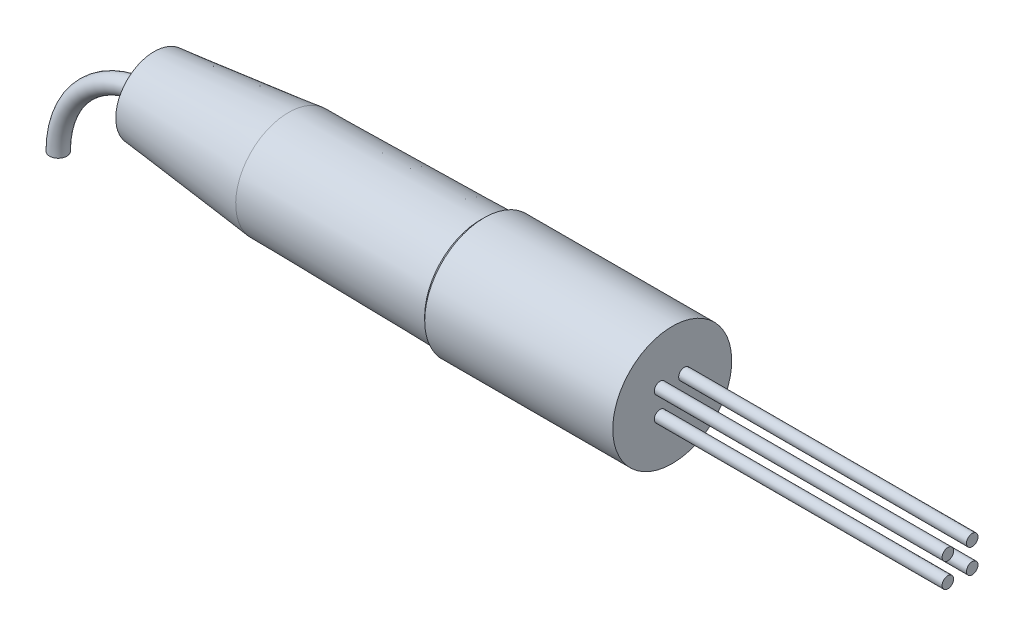
ISO-10303-21;
HEADER;
FILE_DESCRIPTION(('STEP AP214'),'2;1');
FILE_NAME('part.step','',(''),(''),'','','');
FILE_SCHEMA(('AUTOMOTIVE_DESIGN { 1 0 10303 214 1 1 1 1 }'));
ENDSEC;
DATA;
#1=APPLICATION_CONTEXT('core data for automotive mechanical design processes');
#2=APPLICATION_PROTOCOL_DEFINITION('international standard','automotive_design',2000,#1);
#3=PRODUCT_CONTEXT('',#1,'mechanical');
#4=PRODUCT('Part','Part','',(#3));
#5=PRODUCT_RELATED_PRODUCT_CATEGORY('part','',(#4));
#6=PRODUCT_DEFINITION_FORMATION('','',#4);
#7=PRODUCT_DEFINITION_CONTEXT('part definition',#1,'design');
#8=PRODUCT_DEFINITION('design','',#6,#7);
#9=PRODUCT_DEFINITION_SHAPE('','',#8);
#10=(LENGTH_UNIT() NAMED_UNIT(*) SI_UNIT(.MILLI.,.METRE.));
#11=(NAMED_UNIT(*) PLANE_ANGLE_UNIT() SI_UNIT($,.RADIAN.));
#12=(NAMED_UNIT(*) SI_UNIT($,.STERADIAN.) SOLID_ANGLE_UNIT());
#13=UNCERTAINTY_MEASURE_WITH_UNIT(LENGTH_MEASURE(1.E-05),#10,'distance_accuracy_value','');
#14=(GEOMETRIC_REPRESENTATION_CONTEXT(3) GLOBAL_UNCERTAINTY_ASSIGNED_CONTEXT((#13)) GLOBAL_UNIT_ASSIGNED_CONTEXT((#10,
#11,#12)) REPRESENTATION_CONTEXT('',''));
#15=CARTESIAN_POINT('',(0.,0.,0.));
#16=DIRECTION('',(0.,0.,1.));
#17=DIRECTION('',(1.,0.,0.));
#18=AXIS2_PLACEMENT_3D('',#15,#16,#17);
#19=CARTESIAN_POINT('',(0.,0.,0.));
#20=DIRECTION('',(-1.,0.,0.));
#21=DIRECTION('',(0.,-1.,0.));
#22=AXIS2_PLACEMENT_3D('',#19,#20,#21);
#23=PLANE('',#22);
#24=CARTESIAN_POINT('',(0.,0.635000000000003,-0.634999999999999));
#25=DIRECTION('',(-1.,0.,0.));
#26=DIRECTION('',(0.,-1.,0.));
#27=AXIS2_PLACEMENT_3D('',#24,#25,#26);
#28=CIRCLE('',#27,0.3);
#29=CARTESIAN_POINT('',(0.,0.335000000000003,-0.634999999999999));
#30=VERTEX_POINT('',#29);
#31=EDGE_CURVE('E37',#30,#30,#28,.F.);
#32=ORIENTED_EDGE('',*,*,#31,.F.);
#33=EDGE_LOOP('',(#32));
#34=FACE_BOUND('',#33,.T.);
#35=CARTESIAN_POINT('',(0.,0.635,0.634999999999999));
#36=DIRECTION('',(-1.,0.,0.));
#37=DIRECTION('',(0.,-1.,0.));
#38=AXIS2_PLACEMENT_3D('',#35,#36,#37);
#39=CIRCLE('',#38,0.3);
#40=CARTESIAN_POINT('',(0.,0.335,0.634999999999999));
#41=VERTEX_POINT('',#40);
#42=EDGE_CURVE('E45',#41,#41,#39,.F.);
#43=ORIENTED_EDGE('',*,*,#42,.F.);
#44=EDGE_LOOP('',(#43));
#45=FACE_BOUND('',#44,.T.);
#46=CARTESIAN_POINT('',(0.,0.,0.));
#47=DIRECTION('',(-1.,0.,0.));
#48=DIRECTION('',(0.,-1.,0.));
#49=AXIS2_PLACEMENT_3D('',#46,#47,#48);
#50=CIRCLE('',#49,3.1);
#51=CARTESIAN_POINT('',(0.,-3.1,0.));
#52=VERTEX_POINT('',#51);
#53=EDGE_CURVE('E63',#52,#52,#50,.T.);
#54=ORIENTED_EDGE('',*,*,#53,.F.);
#55=EDGE_LOOP('',(#54));
#56=FACE_BOUND('',#55,.T.);
#57=CARTESIAN_POINT('',(0.,-0.635,0.634999999999999));
#58=DIRECTION('',(-1.,0.,0.));
#59=DIRECTION('',(0.,-1.,0.));
#60=AXIS2_PLACEMENT_3D('',#57,#58,#59);
#61=CIRCLE('',#60,0.3);
#62=CARTESIAN_POINT('',(0.,-0.935,0.634999999999999));
#63=VERTEX_POINT('',#62);
#64=EDGE_CURVE('E41',#63,#63,#61,.F.);
#65=ORIENTED_EDGE('',*,*,#64,.F.);
#66=EDGE_LOOP('',(#65));
#67=FACE_BOUND('',#66,.T.);
#68=CARTESIAN_POINT('',(0.,-0.634999999999996,-0.634999999999999));
#69=DIRECTION('',(-1.,0.,0.));
#70=DIRECTION('',(0.,-1.,0.));
#71=AXIS2_PLACEMENT_3D('',#68,#69,#70);
#72=CIRCLE('',#71,0.3);
#73=CARTESIAN_POINT('',(0.,-0.934999999999996,-0.634999999999999));
#74=VERTEX_POINT('',#73);
#75=EDGE_CURVE('E10',#74,#74,#72,.F.);
#76=ORIENTED_EDGE('',*,*,#75,.F.);
#77=EDGE_LOOP('',(#76));
#78=FACE_BOUND('',#77,.T.);
#79=ADVANCED_FACE('F31',(#34,#45,#56,#67,#78),#23,.F.);
#80=CARTESIAN_POINT('',(-27.,1.99999999999999,0.));
#81=DIRECTION('',(1.,0.,0.));
#82=DIRECTION('',(0.,1.,0.));
#83=AXIS2_PLACEMENT_3D('',#80,#81,#82);
#84=PLANE('',#83);
#85=CARTESIAN_POINT('',(-27.,0.,0.));
#86=DIRECTION('',(-1.,0.,0.));
#87=DIRECTION('',(0.,-1.,0.));
#88=AXIS2_PLACEMENT_3D('',#85,#86,#87);
#89=CIRCLE('',#88,1.99999999999999);
#90=CARTESIAN_POINT('',(-27.,-1.99999999999999,0.));
#91=VERTEX_POINT('',#90);
#92=EDGE_CURVE('E54',#91,#91,#89,.T.);
#93=ORIENTED_EDGE('',*,*,#92,.T.);
#94=EDGE_LOOP('',(#93));
#95=FACE_BOUND('',#94,.T.);
#96=CARTESIAN_POINT('',(-27.,0.,0.));
#97=DIRECTION('',(-1.,0.,0.));
#98=DIRECTION('',(0.,-1.,0.));
#99=AXIS2_PLACEMENT_3D('',#96,#97,#98);
#100=CIRCLE('',#99,0.45);
#101=CARTESIAN_POINT('',(-27.,0.45,0.));
#102=VERTEX_POINT('',#101);
#103=EDGE_CURVE('E50',#102,#102,#100,.T.);
#104=ORIENTED_EDGE('',*,*,#103,.F.);
#105=EDGE_LOOP('',(#104));
#106=FACE_BOUND('',#105,.T.);
#107=ADVANCED_FACE('F99',(#95,#106),#84,.F.);
#108=CARTESIAN_POINT('',(-20.,0.,0.));
#109=DIRECTION('',(1.,0.,0.));
#110=DIRECTION('',(0.,1.,0.));
#111=AXIS2_PLACEMENT_3D('',#108,#109,#110);
#112=CONICAL_SURFACE('',#111,2.75,0.106735672649136);
#113=ORIENTED_EDGE('',*,*,#92,.F.);
#114=EDGE_LOOP('',(#113));
#115=FACE_BOUND('',#114,.T.);
#116=CARTESIAN_POINT('',(-20.,0.,0.));
#117=DIRECTION('',(-1.,0.,0.));
#118=DIRECTION('',(0.,-1.,0.));
#119=AXIS2_PLACEMENT_3D('',#116,#117,#118);
#120=CIRCLE('',#119,2.75);
#121=CARTESIAN_POINT('',(-20.,-2.75,0.));
#122=VERTEX_POINT('',#121);
#123=EDGE_CURVE('E57',#122,#122,#120,.T.);
#124=ORIENTED_EDGE('',*,*,#123,.T.);
#125=EDGE_LOOP('',(#124));
#126=FACE_BOUND('',#125,.T.);
#127=ADVANCED_FACE('F104',(#115,#126),#112,.T.);
#128=CARTESIAN_POINT('',(-10.,0.,0.));
#129=DIRECTION('',(1.,0.,0.));
#130=DIRECTION('',(0.,1.,0.));
#131=AXIS2_PLACEMENT_3D('',#128,#129,#130);
#132=CONICAL_SURFACE('',#131,2.9,0.0149988751518507);
#133=ORIENTED_EDGE('',*,*,#123,.F.);
#134=EDGE_LOOP('',(#133));
#135=FACE_BOUND('',#134,.T.);
#136=CARTESIAN_POINT('',(-10.,0.,0.));
#137=DIRECTION('',(-1.,0.,0.));
#138=DIRECTION('',(0.,-1.,0.));
#139=AXIS2_PLACEMENT_3D('',#136,#137,#138);
#140=CIRCLE('',#139,2.9);
#141=CARTESIAN_POINT('',(-10.,-2.9,0.));
#142=VERTEX_POINT('',#141);
#143=EDGE_CURVE('E60',#142,#142,#140,.T.);
#144=ORIENTED_EDGE('',*,*,#143,.T.);
#145=EDGE_LOOP('',(#144));
#146=FACE_BOUND('',#145,.T.);
#147=ADVANCED_FACE('F150',(#135,#146),#132,.T.);
#148=CARTESIAN_POINT('',(-27.,0.,0.));
#149=DIRECTION('',(-1.,0.,0.));
#150=DIRECTION('',(0.,-1.,0.));
#151=AXIS2_PLACEMENT_3D('',#148,#149,#150);
#152=CYLINDRICAL_SURFACE('',#151,3.1);
#153=CARTESIAN_POINT('',(-9.80000000000001,0.,0.));
#154=DIRECTION('',(1.,0.,0.));
#155=DIRECTION('',(0.,1.,0.));
#156=AXIS2_PLACEMENT_3D('',#153,#154,#155);
#157=CIRCLE('',#156,3.1);
#158=CARTESIAN_POINT('',(-9.80000000000001,3.1,0.));
#159=VERTEX_POINT('',#158);
#160=EDGE_CURVE('E51',#159,#159,#157,.T.);
#161=ORIENTED_EDGE('',*,*,#160,.T.);
#162=EDGE_LOOP('',(#161));
#163=FACE_BOUND('',#162,.T.);
#164=ORIENTED_EDGE('',*,*,#53,.T.);
#165=EDGE_LOOP('',(#164));
#166=FACE_BOUND('',#165,.T.);
#167=ADVANCED_FACE('F146',(#163,#166),#152,.T.);
#168=CARTESIAN_POINT('',(-10.,0.,0.));
#169=DIRECTION('',(1.,0.,0.));
#170=DIRECTION('',(0.,1.,0.));
#171=AXIS2_PLACEMENT_3D('',#168,#169,#170);
#172=CONICAL_SURFACE('',#171,2.9,0.785398163397456);
#173=ORIENTED_EDGE('',*,*,#160,.F.);
#174=EDGE_LOOP('',(#173));
#175=FACE_BOUND('',#174,.T.);
#176=ORIENTED_EDGE('',*,*,#143,.F.);
#177=EDGE_LOOP('',(#176));
#178=FACE_BOUND('',#177,.T.);
#179=ADVANCED_FACE('F142',(#175,#178),#172,.T.);
#180=CARTESIAN_POINT('',(-27.,-5.,0.));
#181=DIRECTION('',(0.,0.,-1.));
#182=DIRECTION('',(-1.,0.,0.));
#183=AXIS2_PLACEMENT_3D('',#180,#181,#182);
#184=TOROIDAL_SURFACE('',#183,5.,0.45);
#185=CARTESIAN_POINT('',(-32.,-5.,0.));
#186=DIRECTION('',(0.,-1.,0.));
#187=DIRECTION('',(1.,0.,0.));
#188=AXIS2_PLACEMENT_3D('',#185,#186,#187);
#189=CIRCLE('',#188,0.45);
#190=CARTESIAN_POINT('',(-32.45,-5.,0.));
#191=VERTEX_POINT('',#190);
#192=EDGE_CURVE('E66',#191,#191,#189,.T.);
#193=CARTESIAN_POINT('',(-27.,-5.,0.));
#194=DIRECTION('',(0.,0.,-1.));
#195=DIRECTION('',(-1.,0.,0.));
#196=AXIS2_PLACEMENT_3D('',#193,#194,#195);
#197=CIRCLE('',#196,5.45);
#198=EDGE_CURVE('',#191,#102,#197,.T.);
#199=ORIENTED_EDGE('',*,*,#192,.F.);
#200=ORIENTED_EDGE('',*,*,#103,.T.);
#201=ORIENTED_EDGE('',*,*,#198,.T.);
#202=ORIENTED_EDGE('',*,*,#198,.F.);
#203=EDGE_LOOP('',(#199,#201,#200,#202));
#204=FACE_BOUND('',#203,.T.);
#205=ADVANCED_FACE('F138',(#204),#184,.T.);
#206=CARTESIAN_POINT('',(-32.,-5.,0.));
#207=DIRECTION('',(0.,-1.,0.));
#208=DIRECTION('',(1.,0.,0.));
#209=AXIS2_PLACEMENT_3D('',#206,#207,#208);
#210=PLANE('',#209);
#211=ORIENTED_EDGE('',*,*,#192,.T.);
#212=EDGE_LOOP('',(#211));
#213=FACE_BOUND('',#212,.T.);
#214=ADVANCED_FACE('F134',(#213),#210,.T.);
#215=CARTESIAN_POINT('',(15.,0.635,0.634999999999999));
#216=DIRECTION('',(-1.,0.,0.));
#217=DIRECTION('',(0.,-1.,0.));
#218=AXIS2_PLACEMENT_3D('',#215,#216,#217);
#219=CYLINDRICAL_SURFACE('',#218,0.3);
#220=CARTESIAN_POINT('',(15.,0.635,0.634999999999999));
#221=DIRECTION('',(1.,0.,0.));
#222=DIRECTION('',(0.,1.,0.));
#223=AXIS2_PLACEMENT_3D('',#220,#221,#222);
#224=CIRCLE('',#223,0.3);
#225=CARTESIAN_POINT('',(15.,0.935,0.634999999999999));
#226=VERTEX_POINT('',#225);
#227=EDGE_CURVE('E69',#226,#226,#224,.T.);
#228=ORIENTED_EDGE('',*,*,#227,.F.);
#229=EDGE_LOOP('',(#228));
#230=FACE_BOUND('',#229,.T.);
#231=ORIENTED_EDGE('',*,*,#42,.T.);
#232=EDGE_LOOP('',(#231));
#233=FACE_BOUND('',#232,.T.);
#234=ADVANCED_FACE('F126',(#230,#233),#219,.T.);
#235=CARTESIAN_POINT('',(15.,0.635,0.634999999999999));
#236=DIRECTION('',(1.,0.,0.));
#237=DIRECTION('',(0.,1.,0.));
#238=AXIS2_PLACEMENT_3D('',#235,#236,#237);
#239=PLANE('',#238);
#240=ORIENTED_EDGE('',*,*,#227,.T.);
#241=EDGE_LOOP('',(#240));
#242=FACE_BOUND('',#241,.T.);
#243=ADVANCED_FACE('F117',(#242),#239,.T.);
#244=CARTESIAN_POINT('',(15.,-0.635,0.634999999999999));
#245=DIRECTION('',(-1.,0.,0.));
#246=DIRECTION('',(0.,-1.,0.));
#247=AXIS2_PLACEMENT_3D('',#244,#245,#246);
#248=CYLINDRICAL_SURFACE('',#247,0.3);
#249=CARTESIAN_POINT('',(15.,-0.635,0.634999999999999));
#250=DIRECTION('',(1.,0.,0.));
#251=DIRECTION('',(0.,-1.,0.));
#252=AXIS2_PLACEMENT_3D('',#249,#250,#251);
#253=CIRCLE('',#252,0.3);
#254=CARTESIAN_POINT('',(15.,-0.935,0.634999999999999));
#255=VERTEX_POINT('',#254);
#256=EDGE_CURVE('E74',#255,#255,#253,.T.);
#257=ORIENTED_EDGE('',*,*,#256,.F.);
#258=EDGE_LOOP('',(#257));
#259=FACE_BOUND('',#258,.T.);
#260=ORIENTED_EDGE('',*,*,#64,.T.);
#261=EDGE_LOOP('',(#260));
#262=FACE_BOUND('',#261,.T.);
#263=ADVANCED_FACE('F114',(#259,#262),#248,.T.);
#264=CARTESIAN_POINT('',(15.,-0.635,0.634999999999999));
#265=DIRECTION('',(-1.,0.,0.));
#266=DIRECTION('',(0.,-1.,0.));
#267=AXIS2_PLACEMENT_3D('',#264,#265,#266);
#268=PLANE('',#267);
#269=ORIENTED_EDGE('',*,*,#256,.T.);
#270=EDGE_LOOP('',(#269));
#271=FACE_BOUND('',#270,.T.);
#272=ADVANCED_FACE('F116',(#271),#268,.F.);
#273=CARTESIAN_POINT('',(15.,0.635000000000003,-0.634999999999999));
#274=DIRECTION('',(-1.,0.,0.));
#275=DIRECTION('',(0.,-1.,0.));
#276=AXIS2_PLACEMENT_3D('',#273,#274,#275);
#277=CYLINDRICAL_SURFACE('',#276,0.3);
#278=CARTESIAN_POINT('',(15.,0.635000000000003,-0.634999999999999));
#279=DIRECTION('',(1.,0.,0.));
#280=DIRECTION('',(0.,-1.,0.));
#281=AXIS2_PLACEMENT_3D('',#278,#279,#280);
#282=CIRCLE('',#281,0.3);
#283=CARTESIAN_POINT('',(15.,0.335000000000003,-0.634999999999999));
#284=VERTEX_POINT('',#283);
#285=EDGE_CURVE('E77',#284,#284,#282,.T.);
#286=ORIENTED_EDGE('',*,*,#285,.F.);
#287=EDGE_LOOP('',(#286));
#288=FACE_BOUND('',#287,.T.);
#289=ORIENTED_EDGE('',*,*,#31,.T.);
#290=EDGE_LOOP('',(#289));
#291=FACE_BOUND('',#290,.T.);
#292=ADVANCED_FACE('F95',(#288,#291),#277,.T.);
#293=CARTESIAN_POINT('',(15.,0.635000000000003,-0.634999999999999));
#294=DIRECTION('',(-1.,0.,0.));
#295=DIRECTION('',(0.,-1.,0.));
#296=AXIS2_PLACEMENT_3D('',#293,#294,#295);
#297=PLANE('',#296);
#298=ORIENTED_EDGE('',*,*,#285,.T.);
#299=EDGE_LOOP('',(#298));
#300=FACE_BOUND('',#299,.T.);
#301=ADVANCED_FACE('F88',(#300),#297,.F.);
#302=CARTESIAN_POINT('',(15.,-0.634999999999997,-0.634999999999999));
#303=DIRECTION('',(-1.,0.,0.));
#304=DIRECTION('',(0.,-1.,0.));
#305=AXIS2_PLACEMENT_3D('',#302,#303,#304);
#306=CYLINDRICAL_SURFACE('',#305,0.3);
#307=CARTESIAN_POINT('',(15.,-0.634999999999997,-0.634999999999999));
#308=DIRECTION('',(1.,0.,0.));
#309=DIRECTION('',(0.,1.,0.));
#310=AXIS2_PLACEMENT_3D('',#307,#308,#309);
#311=CIRCLE('',#310,0.3);
#312=CARTESIAN_POINT('',(15.,-0.334999999999997,-0.634999999999999));
#313=VERTEX_POINT('',#312);
#314=EDGE_CURVE('E80',#313,#313,#311,.T.);
#315=ORIENTED_EDGE('',*,*,#314,.F.);
#316=EDGE_LOOP('',(#315));
#317=FACE_BOUND('',#316,.T.);
#318=ORIENTED_EDGE('',*,*,#75,.T.);
#319=EDGE_LOOP('',(#318));
#320=FACE_BOUND('',#319,.T.);
#321=ADVANCED_FACE('F86',(#317,#320),#306,.T.);
#322=CARTESIAN_POINT('',(15.,-0.634999999999997,-0.634999999999999));
#323=DIRECTION('',(1.,0.,0.));
#324=DIRECTION('',(0.,1.,0.));
#325=AXIS2_PLACEMENT_3D('',#322,#323,#324);
#326=PLANE('',#325);
#327=ORIENTED_EDGE('',*,*,#314,.T.);
#328=EDGE_LOOP('',(#327));
#329=FACE_BOUND('',#328,.T.);
#330=ADVANCED_FACE('F84',(#329),#326,.T.);
#331=CLOSED_SHELL('',(#79,#107,#127,#147,#167,#179,#205,#214,#234,#243,#263,#272,#292,#301,#321,#330));
#332=MANIFOLD_SOLID_BREP('B2',#331);
#333=ADVANCED_BREP_SHAPE_REPRESENTATION('',(#18,#332),#14);
#334=SHAPE_DEFINITION_REPRESENTATION(#9,#333);
ENDSEC;
END-ISO-10303-21;
